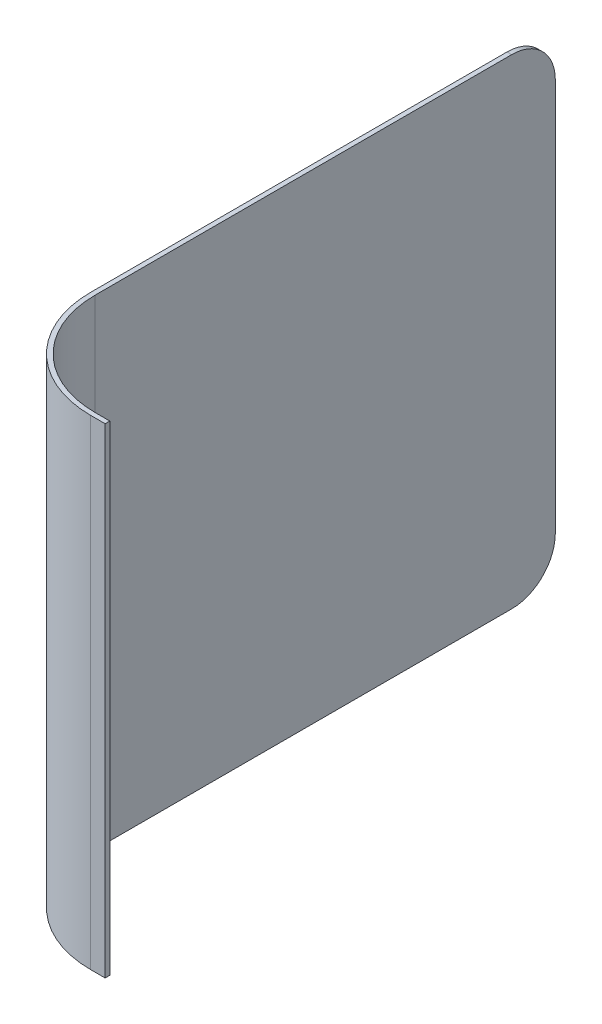
ISO-10303-21;
HEADER;
FILE_DESCRIPTION(('STEP AP214'),'2;1');
FILE_NAME('part.step','',(''),(''),'','','');
FILE_SCHEMA(('AUTOMOTIVE_DESIGN { 1 0 10303 214 1 1 1 1 }'));
ENDSEC;
DATA;
#1=APPLICATION_CONTEXT('core data for automotive mechanical design processes');
#2=APPLICATION_PROTOCOL_DEFINITION('international standard','automotive_design',2000,#1);
#3=PRODUCT_CONTEXT('',#1,'mechanical');
#4=PRODUCT('Part','Part','',(#3));
#5=PRODUCT_RELATED_PRODUCT_CATEGORY('part','',(#4));
#6=PRODUCT_DEFINITION_FORMATION('','',#4);
#7=PRODUCT_DEFINITION_CONTEXT('part definition',#1,'design');
#8=PRODUCT_DEFINITION('design','',#6,#7);
#9=PRODUCT_DEFINITION_SHAPE('','',#8);
#10=(LENGTH_UNIT() NAMED_UNIT(*) SI_UNIT(.MILLI.,.METRE.));
#11=(NAMED_UNIT(*) PLANE_ANGLE_UNIT() SI_UNIT($,.RADIAN.));
#12=(NAMED_UNIT(*) SI_UNIT($,.STERADIAN.) SOLID_ANGLE_UNIT());
#13=UNCERTAINTY_MEASURE_WITH_UNIT(LENGTH_MEASURE(1.E-05),#10,'distance_accuracy_value','');
#14=(GEOMETRIC_REPRESENTATION_CONTEXT(3) GLOBAL_UNCERTAINTY_ASSIGNED_CONTEXT((#13)) GLOBAL_UNIT_ASSIGNED_CONTEXT((#10,
#11,#12)) REPRESENTATION_CONTEXT('',''));
#15=CARTESIAN_POINT('',(0.,0.,0.));
#16=DIRECTION('',(0.,0.,1.));
#17=DIRECTION('',(1.,0.,0.));
#18=AXIS2_PLACEMENT_3D('',#15,#16,#17);
#19=CARTESIAN_POINT('',(-240.,-65.2533491308973,-121.285023565587));
#20=DIRECTION('',(1.,0.,0.));
#21=DIRECTION('',(0.,0.,-1.));
#22=AXIS2_PLACEMENT_3D('',#19,#20,#21);
#23=PLANE('',#22);
#24=DIRECTION('',(0.,0.,-1.));
#25=VECTOR('',#24,1.);
#26=CARTESIAN_POINT('',(-240.,410.,268.2));
#27=LINE('',#26,#25);
#28=CARTESIAN_POINT('',(-240.,410.,268.2));
#29=VERTEX_POINT('',#28);
#30=CARTESIAN_POINT('',(-240.,410.,265.));
#31=VERTEX_POINT('',#30);
#32=EDGE_CURVE('E128',#29,#31,#27,.T.);
#33=ORIENTED_EDGE('',*,*,#32,.F.);
#34=DIRECTION('',(0.,-1.,0.));
#35=VECTOR('',#34,1.);
#36=CARTESIAN_POINT('',(-240.,450.,268.2));
#37=LINE('',#36,#35);
#38=CARTESIAN_POINT('',(-240.,80.,268.2));
#39=VERTEX_POINT('',#38);
#40=EDGE_CURVE('E118',#29,#39,#37,.T.);
#41=ORIENTED_EDGE('',*,*,#40,.T.);
#42=DIRECTION('',(0.,0.,1.));
#43=VECTOR('',#42,1.);
#44=CARTESIAN_POINT('',(-240.,80.,268.2));
#45=LINE('',#44,#43);
#46=CARTESIAN_POINT('',(-240.,80.,265.));
#47=VERTEX_POINT('',#46);
#48=EDGE_CURVE('E123',#47,#39,#45,.T.);
#49=ORIENTED_EDGE('',*,*,#48,.F.);
#50=DIRECTION('',(0.,-1.,0.));
#51=VECTOR('',#50,1.);
#52=CARTESIAN_POINT('',(-240.,450.,265.));
#53=LINE('',#52,#51);
#54=EDGE_CURVE('E41',#31,#47,#53,.T.);
#55=ORIENTED_EDGE('',*,*,#54,.F.);
#56=EDGE_LOOP('',(#33,#41,#49,#55));
#57=FACE_BOUND('',#56,.T.);
#58=ADVANCED_FACE('F37',(#57),#23,.T.);
#59=CARTESIAN_POINT('',(250.,410.,268.2));
#60=DIRECTION('',(0.,1.,0.));
#61=DIRECTION('',(-1.,0.,0.));
#62=AXIS2_PLACEMENT_3D('',#59,#60,#61);
#63=PLANE('',#62);
#64=DIRECTION('',(1.,0.,0.));
#65=VECTOR('',#64,1.);
#66=CARTESIAN_POINT('',(-250.,410.,268.2));
#67=LINE('',#66,#65);
#68=CARTESIAN_POINT('',(-250.,410.,268.2));
#69=VERTEX_POINT('',#68);
#70=EDGE_CURVE('E11',#69,#29,#67,.T.);
#71=ORIENTED_EDGE('',*,*,#70,.T.);
#72=ORIENTED_EDGE('',*,*,#32,.T.);
#73=DIRECTION('',(1.,0.,0.));
#74=VECTOR('',#73,1.);
#75=CARTESIAN_POINT('',(-250.,410.,265.));
#76=LINE('',#75,#74);
#77=CARTESIAN_POINT('',(-250.,410.,265.));
#78=VERTEX_POINT('',#77);
#79=EDGE_CURVE('E134',#78,#31,#76,.T.);
#80=ORIENTED_EDGE('',*,*,#79,.F.);
#81=CARTESIAN_POINT('',(-250.,410.,195.));
#82=DIRECTION('',(0.,1.,0.));
#83=DIRECTION('',(-1.,0.,0.));
#84=AXIS2_PLACEMENT_3D('',#81,#82,#83);
#85=CIRCLE('',#84,70.);
#86=CARTESIAN_POINT('',(-320.,410.,195.));
#87=VERTEX_POINT('',#86);
#88=EDGE_CURVE('E162',#87,#78,#85,.T.);
#89=ORIENTED_EDGE('',*,*,#88,.F.);
#90=DIRECTION('',(0.,0.,1.));
#91=VECTOR('',#90,1.);
#92=CARTESIAN_POINT('',(-320.,410.,-265.));
#93=LINE('',#92,#91);
#94=CARTESIAN_POINT('',(-320.,410.,-91.2750235655875));
#95=VERTEX_POINT('',#94);
#96=EDGE_CURVE('E157',#95,#87,#93,.T.);
#97=ORIENTED_EDGE('',*,*,#96,.F.);
#98=DIRECTION('',(1.,0.,0.));
#99=VECTOR('',#98,1.);
#100=CARTESIAN_POINT('',(-323.2,410.,-91.2750235655875));
#101=LINE('',#100,#99);
#102=CARTESIAN_POINT('',(-323.2,410.,-91.2750235655875));
#103=VERTEX_POINT('',#102);
#104=EDGE_CURVE('E140',#103,#95,#101,.T.);
#105=ORIENTED_EDGE('',*,*,#104,.F.);
#106=DIRECTION('',(0.,0.,1.));
#107=VECTOR('',#106,1.);
#108=CARTESIAN_POINT('',(-323.2,410.,-265.));
#109=LINE('',#108,#107);
#110=CARTESIAN_POINT('',(-323.2,410.,195.));
#111=VERTEX_POINT('',#110);
#112=EDGE_CURVE('E175',#103,#111,#109,.T.);
#113=ORIENTED_EDGE('',*,*,#112,.T.);
#114=CARTESIAN_POINT('',(-250.,410.,195.));
#115=DIRECTION('',(0.,1.,0.));
#116=DIRECTION('',(-1.,0.,0.));
#117=AXIS2_PLACEMENT_3D('',#114,#115,#116);
#118=CIRCLE('',#117,73.2);
#119=EDGE_CURVE('E170',#111,#69,#118,.T.);
#120=ORIENTED_EDGE('',*,*,#119,.T.);
#121=EDGE_LOOP('',(#71,#72,#80,#89,#97,#105,#113,#120));
#122=FACE_BOUND('',#121,.T.);
#123=ADVANCED_FACE('F204',(#122),#63,.T.);
#124=CARTESIAN_POINT('',(250.,80.,268.2));
#125=DIRECTION('',(0.,-1.,0.));
#126=DIRECTION('',(1.,0.,0.));
#127=AXIS2_PLACEMENT_3D('',#124,#125,#126);
#128=PLANE('',#127);
#129=DIRECTION('',(-1.,0.,0.));
#130=VECTOR('',#129,1.);
#131=CARTESIAN_POINT('',(-250.,80.,265.));
#132=LINE('',#131,#130);
#133=CARTESIAN_POINT('',(-250.,80.,265.));
#134=VERTEX_POINT('',#133);
#135=EDGE_CURVE('E126',#47,#134,#132,.T.);
#136=ORIENTED_EDGE('',*,*,#135,.F.);
#137=ORIENTED_EDGE('',*,*,#48,.T.);
#138=DIRECTION('',(-1.,0.,0.));
#139=VECTOR('',#138,1.);
#140=CARTESIAN_POINT('',(-250.,80.,268.2));
#141=LINE('',#140,#139);
#142=CARTESIAN_POINT('',(-250.,80.,268.2));
#143=VERTEX_POINT('',#142);
#144=EDGE_CURVE('E46',#39,#143,#141,.T.);
#145=ORIENTED_EDGE('',*,*,#144,.T.);
#146=CARTESIAN_POINT('',(-250.,80.,195.));
#147=DIRECTION('',(0.,-1.,0.));
#148=DIRECTION('',(1.,0.,0.));
#149=AXIS2_PLACEMENT_3D('',#146,#147,#148);
#150=CIRCLE('',#149,73.2);
#151=CARTESIAN_POINT('',(-323.2,80.,195.));
#152=VERTEX_POINT('',#151);
#153=EDGE_CURVE('E168',#143,#152,#150,.T.);
#154=ORIENTED_EDGE('',*,*,#153,.T.);
#155=DIRECTION('',(0.,0.,-1.));
#156=VECTOR('',#155,1.);
#157=CARTESIAN_POINT('',(-323.2,80.,-265.));
#158=LINE('',#157,#156);
#159=CARTESIAN_POINT('',(-323.2,79.9999999999999,-91.2750235655875));
#160=VERTEX_POINT('',#159);
#161=EDGE_CURVE('E172',#152,#160,#158,.T.);
#162=ORIENTED_EDGE('',*,*,#161,.T.);
#163=DIRECTION('',(1.,0.,0.));
#164=VECTOR('',#163,1.);
#165=CARTESIAN_POINT('',(-323.2,79.9999999999999,-91.2750235655875));
#166=LINE('',#165,#164);
#167=CARTESIAN_POINT('',(-320.,79.9999999999999,-91.2750235655875));
#168=VERTEX_POINT('',#167);
#169=EDGE_CURVE('E146',#160,#168,#166,.T.);
#170=ORIENTED_EDGE('',*,*,#169,.T.);
#171=DIRECTION('',(0.,0.,-1.));
#172=VECTOR('',#171,1.);
#173=CARTESIAN_POINT('',(-320.,80.,-265.));
#174=LINE('',#173,#172);
#175=CARTESIAN_POINT('',(-320.,80.,195.));
#176=VERTEX_POINT('',#175);
#177=EDGE_CURVE('E159',#176,#168,#174,.T.);
#178=ORIENTED_EDGE('',*,*,#177,.F.);
#179=CARTESIAN_POINT('',(-250.,80.,195.));
#180=DIRECTION('',(0.,-1.,0.));
#181=DIRECTION('',(1.,0.,0.));
#182=AXIS2_PLACEMENT_3D('',#179,#180,#181);
#183=CIRCLE('',#182,70.);
#184=EDGE_CURVE('E165',#134,#176,#183,.T.);
#185=ORIENTED_EDGE('',*,*,#184,.F.);
#186=EDGE_LOOP('',(#136,#137,#145,#154,#162,#170,#178,#185));
#187=FACE_BOUND('',#186,.T.);
#188=ADVANCED_FACE('F124',(#187),#128,.T.);
#189=CARTESIAN_POINT('',(-250.,450.,265.));
#190=DIRECTION('',(0.,0.,-1.));
#191=DIRECTION('',(-1.,0.,0.));
#192=AXIS2_PLACEMENT_3D('',#189,#190,#191);
#193=PLANE('',#192);
#194=ORIENTED_EDGE('',*,*,#79,.T.);
#195=ORIENTED_EDGE('',*,*,#54,.T.);
#196=ORIENTED_EDGE('',*,*,#135,.T.);
#197=DIRECTION('',(0.,-1.,0.));
#198=VECTOR('',#197,1.);
#199=CARTESIAN_POINT('',(-250.,450.,265.));
#200=LINE('',#199,#198);
#201=EDGE_CURVE('E148',#78,#134,#200,.T.);
#202=ORIENTED_EDGE('',*,*,#201,.F.);
#203=EDGE_LOOP('',(#194,#195,#196,#202));
#204=FACE_BOUND('',#203,.T.);
#205=ADVANCED_FACE('F39',(#204),#193,.T.);
#206=CARTESIAN_POINT('',(-250.,450.,268.2));
#207=DIRECTION('',(0.,0.,-1.));
#208=DIRECTION('',(-1.,0.,0.));
#209=AXIS2_PLACEMENT_3D('',#206,#207,#208);
#210=PLANE('',#209);
#211=ORIENTED_EDGE('',*,*,#40,.F.);
#212=ORIENTED_EDGE('',*,*,#70,.F.);
#213=DIRECTION('',(0.,1.,0.));
#214=VECTOR('',#213,1.);
#215=CARTESIAN_POINT('',(-250.,450.,268.2));
#216=LINE('',#215,#214);
#217=EDGE_CURVE('E54',#69,#143,#216,.F.);
#218=ORIENTED_EDGE('',*,*,#217,.T.);
#219=ORIENTED_EDGE('',*,*,#144,.F.);
#220=EDGE_LOOP('',(#211,#212,#218,#219));
#221=FACE_BOUND('',#220,.T.);
#222=ADVANCED_FACE('F115',(#221),#210,.F.);
#223=CARTESIAN_POINT('',(-323.2,380.,-91.2750235655875));
#224=DIRECTION('',(1.,0.,0.));
#225=DIRECTION('',(0.,0.,-1.));
#226=AXIS2_PLACEMENT_3D('',#223,#224,#225);
#227=CYLINDRICAL_SURFACE('',#226,30.);
#228=CARTESIAN_POINT('',(-320.,380.,-91.2750235655875));
#229=DIRECTION('',(1.,0.,0.));
#230=DIRECTION('',(0.,0.,-1.));
#231=AXIS2_PLACEMENT_3D('',#228,#229,#230);
#232=CIRCLE('',#231,30.);
#233=CARTESIAN_POINT('',(-320.,380.,-121.275023565587));
#234=VERTEX_POINT('',#233);
#235=EDGE_CURVE('E138',#234,#95,#232,.T.);
#236=ORIENTED_EDGE('',*,*,#235,.F.);
#237=DIRECTION('',(1.,0.,0.));
#238=VECTOR('',#237,1.);
#239=CARTESIAN_POINT('',(-323.2,380.,-121.275023565587));
#240=LINE('',#239,#238);
#241=CARTESIAN_POINT('',(-323.2,380.,-121.275023565587));
#242=VERTEX_POINT('',#241);
#243=EDGE_CURVE('E142',#242,#234,#240,.T.);
#244=ORIENTED_EDGE('',*,*,#243,.F.);
#245=CARTESIAN_POINT('',(-323.2,380.,-91.2750235655875));
#246=DIRECTION('',(1.,0.,0.));
#247=DIRECTION('',(0.,0.,-1.));
#248=AXIS2_PLACEMENT_3D('',#245,#246,#247);
#249=CIRCLE('',#248,30.);
#250=EDGE_CURVE('E119',#242,#103,#249,.T.);
#251=ORIENTED_EDGE('',*,*,#250,.T.);
#252=ORIENTED_EDGE('',*,*,#104,.T.);
#253=EDGE_LOOP('',(#236,#244,#251,#252));
#254=FACE_BOUND('',#253,.T.);
#255=ADVANCED_FACE('F219',(#254),#227,.T.);
#256=CARTESIAN_POINT('',(-323.2,110.,-91.2750235655875));
#257=DIRECTION('',(1.,0.,0.));
#258=DIRECTION('',(0.,0.,-1.));
#259=AXIS2_PLACEMENT_3D('',#256,#257,#258);
#260=CYLINDRICAL_SURFACE('',#259,30.);
#261=CARTESIAN_POINT('',(-320.,110.,-91.2750235655875));
#262=DIRECTION('',(1.,0.,0.));
#263=DIRECTION('',(0.,0.,-1.));
#264=AXIS2_PLACEMENT_3D('',#261,#262,#263);
#265=CIRCLE('',#264,30.);
#266=CARTESIAN_POINT('',(-320.,110.,-121.275023565587));
#267=VERTEX_POINT('',#266);
#268=EDGE_CURVE('E154',#168,#267,#265,.T.);
#269=ORIENTED_EDGE('',*,*,#268,.F.);
#270=ORIENTED_EDGE('',*,*,#169,.F.);
#271=CARTESIAN_POINT('',(-323.2,110.,-91.2750235655875));
#272=DIRECTION('',(1.,0.,0.));
#273=DIRECTION('',(0.,0.,-1.));
#274=AXIS2_PLACEMENT_3D('',#271,#272,#273);
#275=CIRCLE('',#274,30.);
#276=CARTESIAN_POINT('',(-323.2,110.,-121.275023565587));
#277=VERTEX_POINT('',#276);
#278=EDGE_CURVE('E178',#160,#277,#275,.T.);
#279=ORIENTED_EDGE('',*,*,#278,.T.);
#280=DIRECTION('',(1.,0.,0.));
#281=VECTOR('',#280,1.);
#282=CARTESIAN_POINT('',(-323.2,110.,-121.275023565587));
#283=LINE('',#282,#281);
#284=EDGE_CURVE('E144',#277,#267,#283,.T.);
#285=ORIENTED_EDGE('',*,*,#284,.T.);
#286=EDGE_LOOP('',(#269,#270,#279,#285));
#287=FACE_BOUND('',#286,.T.);
#288=ADVANCED_FACE('F214',(#287),#260,.T.);
#289=CARTESIAN_POINT('',(-323.2,110.,-121.275023565587));
#290=DIRECTION('',(0.,0.,-1.));
#291=DIRECTION('',(-1.,0.,0.));
#292=AXIS2_PLACEMENT_3D('',#289,#290,#291);
#293=PLANE('',#292);
#294=DIRECTION('',(0.,1.,0.));
#295=VECTOR('',#294,1.);
#296=CARTESIAN_POINT('',(-320.,450.,-121.275023565587));
#297=LINE('',#296,#295);
#298=EDGE_CURVE('E151',#267,#234,#297,.T.);
#299=ORIENTED_EDGE('',*,*,#298,.F.);
#300=ORIENTED_EDGE('',*,*,#284,.F.);
#301=DIRECTION('',(0.,1.,0.));
#302=VECTOR('',#301,1.);
#303=CARTESIAN_POINT('',(-323.2,450.,-121.275023565587));
#304=LINE('',#303,#302);
#305=EDGE_CURVE('E181',#277,#242,#304,.T.);
#306=ORIENTED_EDGE('',*,*,#305,.T.);
#307=ORIENTED_EDGE('',*,*,#243,.T.);
#308=EDGE_LOOP('',(#299,#300,#306,#307));
#309=FACE_BOUND('',#308,.T.);
#310=ADVANCED_FACE('F217',(#309),#293,.T.);
#311=CARTESIAN_POINT('',(-250.,450.,195.));
#312=DIRECTION('',(0.,-1.,0.));
#313=DIRECTION('',(0.,0.,-1.));
#314=AXIS2_PLACEMENT_3D('',#311,#312,#313);
#315=CYLINDRICAL_SURFACE('',#314,70.);
#316=ORIENTED_EDGE('',*,*,#201,.T.);
#317=ORIENTED_EDGE('',*,*,#184,.T.);
#318=DIRECTION('',(0.,-1.,0.));
#319=VECTOR('',#318,1.);
#320=CARTESIAN_POINT('',(-320.,450.,195.));
#321=LINE('',#320,#319);
#322=EDGE_CURVE('E188',#87,#176,#321,.T.);
#323=ORIENTED_EDGE('',*,*,#322,.F.);
#324=ORIENTED_EDGE('',*,*,#88,.T.);
#325=EDGE_LOOP('',(#316,#317,#323,#324));
#326=FACE_BOUND('',#325,.T.);
#327=ADVANCED_FACE('F194',(#326),#315,.F.);
#328=CARTESIAN_POINT('',(-320.,450.,-265.));
#329=DIRECTION('',(1.,0.,0.));
#330=DIRECTION('',(0.,0.,-1.));
#331=AXIS2_PLACEMENT_3D('',#328,#329,#330);
#332=PLANE('',#331);
#333=ORIENTED_EDGE('',*,*,#322,.T.);
#334=ORIENTED_EDGE('',*,*,#177,.T.);
#335=ORIENTED_EDGE('',*,*,#268,.T.);
#336=ORIENTED_EDGE('',*,*,#298,.T.);
#337=ORIENTED_EDGE('',*,*,#235,.T.);
#338=ORIENTED_EDGE('',*,*,#96,.T.);
#339=EDGE_LOOP('',(#333,#334,#335,#336,#337,#338));
#340=FACE_BOUND('',#339,.T.);
#341=ADVANCED_FACE('F200',(#340),#332,.T.);
#342=CARTESIAN_POINT('',(-250.,450.,195.));
#343=DIRECTION('',(0.,-1.,0.));
#344=DIRECTION('',(0.,0.,-1.));
#345=AXIS2_PLACEMENT_3D('',#342,#343,#344);
#346=CYLINDRICAL_SURFACE('',#345,73.2);
#347=ORIENTED_EDGE('',*,*,#153,.F.);
#348=ORIENTED_EDGE('',*,*,#217,.F.);
#349=ORIENTED_EDGE('',*,*,#119,.F.);
#350=DIRECTION('',(0.,-1.,0.));
#351=VECTOR('',#350,1.);
#352=CARTESIAN_POINT('',(-323.2,450.,195.));
#353=LINE('',#352,#351);
#354=EDGE_CURVE('E137',#111,#152,#353,.T.);
#355=ORIENTED_EDGE('',*,*,#354,.T.);
#356=EDGE_LOOP('',(#347,#348,#349,#355));
#357=FACE_BOUND('',#356,.T.);
#358=ADVANCED_FACE('F206',(#357),#346,.T.);
#359=CARTESIAN_POINT('',(-323.2,450.,-265.));
#360=DIRECTION('',(1.,0.,0.));
#361=DIRECTION('',(0.,0.,-1.));
#362=AXIS2_PLACEMENT_3D('',#359,#360,#361);
#363=PLANE('',#362);
#364=ORIENTED_EDGE('',*,*,#161,.F.);
#365=ORIENTED_EDGE('',*,*,#354,.F.);
#366=ORIENTED_EDGE('',*,*,#112,.F.);
#367=ORIENTED_EDGE('',*,*,#250,.F.);
#368=ORIENTED_EDGE('',*,*,#305,.F.);
#369=ORIENTED_EDGE('',*,*,#278,.F.);
#370=EDGE_LOOP('',(#364,#365,#366,#367,#368,#369));
#371=FACE_BOUND('',#370,.T.);
#372=ADVANCED_FACE('F210',(#371),#363,.F.);
#373=CLOSED_SHELL('',(#58,#123,#188,#205,#222,#255,#288,#310,#327,#341,#358,#372));
#374=MANIFOLD_SOLID_BREP('B2',#373);
#375=ADVANCED_BREP_SHAPE_REPRESENTATION('',(#18,#374),#14);
#376=SHAPE_DEFINITION_REPRESENTATION(#9,#375);
ENDSEC;
END-ISO-10303-21;
